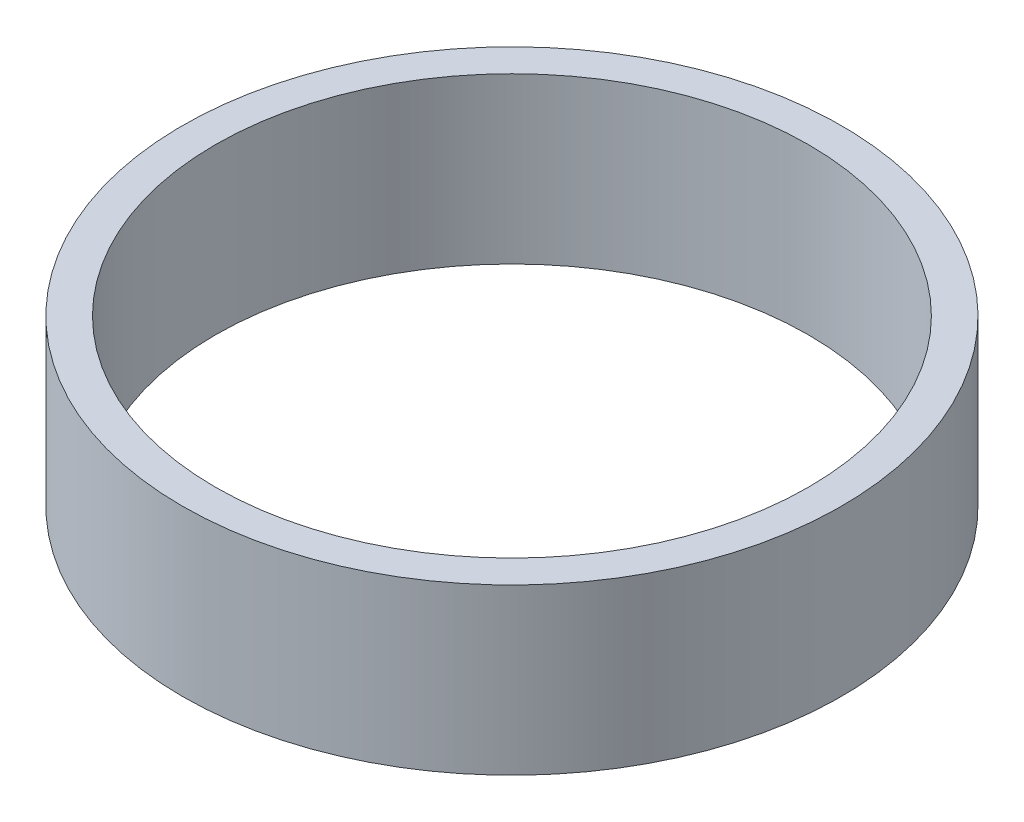
ISO-10303-21;
HEADER;
FILE_DESCRIPTION(('STEP AP214'),'2;1');
FILE_NAME('part.step','',(''),(''),'','','');
FILE_SCHEMA(('AUTOMOTIVE_DESIGN { 1 0 10303 214 1 1 1 1 }'));
ENDSEC;
DATA;
#1=APPLICATION_CONTEXT('core data for automotive mechanical design processes');
#2=APPLICATION_PROTOCOL_DEFINITION('international standard','automotive_design',2000,#1);
#3=PRODUCT_CONTEXT('',#1,'mechanical');
#4=PRODUCT('Part','Part','',(#3));
#5=PRODUCT_RELATED_PRODUCT_CATEGORY('part','',(#4));
#6=PRODUCT_DEFINITION_FORMATION('','',#4);
#7=PRODUCT_DEFINITION_CONTEXT('part definition',#1,'design');
#8=PRODUCT_DEFINITION('design','',#6,#7);
#9=PRODUCT_DEFINITION_SHAPE('','',#8);
#10=(LENGTH_UNIT() NAMED_UNIT(*) SI_UNIT(.MILLI.,.METRE.));
#11=(NAMED_UNIT(*) PLANE_ANGLE_UNIT() SI_UNIT($,.RADIAN.));
#12=(NAMED_UNIT(*) SI_UNIT($,.STERADIAN.) SOLID_ANGLE_UNIT());
#13=UNCERTAINTY_MEASURE_WITH_UNIT(LENGTH_MEASURE(1.E-05),#10,'distance_accuracy_value','');
#14=(GEOMETRIC_REPRESENTATION_CONTEXT(3) GLOBAL_UNCERTAINTY_ASSIGNED_CONTEXT((#13)) GLOBAL_UNIT_ASSIGNED_CONTEXT((#10,
#11,#12)) REPRESENTATION_CONTEXT('',''));
#15=CARTESIAN_POINT('',(0.,0.,0.));
#16=DIRECTION('',(0.,0.,1.));
#17=DIRECTION('',(1.,0.,0.));
#18=AXIS2_PLACEMENT_3D('',#15,#16,#17);
#19=CARTESIAN_POINT('',(0.,20.,0.));
#20=DIRECTION('',(0.,1.,0.));
#21=DIRECTION('',(0.,0.,1.));
#22=AXIS2_PLACEMENT_3D('',#19,#20,#21);
#23=PLANE('',#22);
#24=CARTESIAN_POINT('',(0.,20.,0.));
#25=DIRECTION('',(0.,1.,0.));
#26=DIRECTION('',(0.,0.,1.));
#27=AXIS2_PLACEMENT_3D('',#24,#25,#26);
#28=CIRCLE('',#27,40.);
#29=CARTESIAN_POINT('',(0.,20.,40.));
#30=VERTEX_POINT('',#29);
#31=EDGE_CURVE('E10',#30,#30,#28,.T.);
#32=ORIENTED_EDGE('',*,*,#31,.T.);
#33=EDGE_LOOP('',(#32));
#34=FACE_BOUND('',#33,.T.);
#35=CARTESIAN_POINT('',(0.,20.,0.));
#36=DIRECTION('',(0.,1.,0.));
#37=DIRECTION('',(0.,0.,1.));
#38=AXIS2_PLACEMENT_3D('',#35,#36,#37);
#39=CIRCLE('',#38,36.);
#40=CARTESIAN_POINT('',(0.,20.,36.));
#41=VERTEX_POINT('',#40);
#42=EDGE_CURVE('E46',#41,#41,#39,.T.);
#43=ORIENTED_EDGE('',*,*,#42,.F.);
#44=EDGE_LOOP('',(#43));
#45=FACE_BOUND('',#44,.T.);
#46=ADVANCED_FACE('F35',(#34,#45),#23,.T.);
#47=CARTESIAN_POINT('',(0.,0.,0.));
#48=DIRECTION('',(0.,1.,0.));
#49=DIRECTION('',(0.,0.,1.));
#50=AXIS2_PLACEMENT_3D('',#47,#48,#49);
#51=PLANE('',#50);
#52=CARTESIAN_POINT('',(0.,0.,0.));
#53=DIRECTION('',(0.,1.,0.));
#54=DIRECTION('',(0.,0.,1.));
#55=AXIS2_PLACEMENT_3D('',#52,#53,#54);
#56=CIRCLE('',#55,40.);
#57=CARTESIAN_POINT('',(0.,0.,40.));
#58=VERTEX_POINT('',#57);
#59=EDGE_CURVE('E39',#58,#58,#56,.T.);
#60=ORIENTED_EDGE('',*,*,#59,.F.);
#61=EDGE_LOOP('',(#60));
#62=FACE_BOUND('',#61,.T.);
#63=CARTESIAN_POINT('',(0.,0.,0.));
#64=DIRECTION('',(0.,1.,0.));
#65=DIRECTION('',(0.,0.,1.));
#66=AXIS2_PLACEMENT_3D('',#63,#64,#65);
#67=CIRCLE('',#66,36.);
#68=CARTESIAN_POINT('',(0.,0.,36.));
#69=VERTEX_POINT('',#68);
#70=EDGE_CURVE('E48',#69,#69,#67,.T.);
#71=ORIENTED_EDGE('',*,*,#70,.T.);
#72=EDGE_LOOP('',(#71));
#73=FACE_BOUND('',#72,.T.);
#74=ADVANCED_FACE('F58',(#62,#73),#51,.F.);
#75=CARTESIAN_POINT('',(0.,20.,0.));
#76=DIRECTION('',(0.,-1.,0.));
#77=DIRECTION('',(0.,0.,-1.));
#78=AXIS2_PLACEMENT_3D('',#75,#76,#77);
#79=CYLINDRICAL_SURFACE('',#78,40.);
#80=ORIENTED_EDGE('',*,*,#31,.F.);
#81=EDGE_LOOP('',(#80));
#82=FACE_BOUND('',#81,.T.);
#83=ORIENTED_EDGE('',*,*,#59,.T.);
#84=EDGE_LOOP('',(#83));
#85=FACE_BOUND('',#84,.T.);
#86=ADVANCED_FACE('F37',(#82,#85),#79,.T.);
#87=CARTESIAN_POINT('',(0.,20.,0.));
#88=DIRECTION('',(0.,-1.,0.));
#89=DIRECTION('',(0.,0.,-1.));
#90=AXIS2_PLACEMENT_3D('',#87,#88,#89);
#91=CYLINDRICAL_SURFACE('',#90,36.);
#92=ORIENTED_EDGE('',*,*,#42,.T.);
#93=EDGE_LOOP('',(#92));
#94=FACE_BOUND('',#93,.T.);
#95=ORIENTED_EDGE('',*,*,#70,.F.);
#96=EDGE_LOOP('',(#95));
#97=FACE_BOUND('',#96,.T.);
#98=ADVANCED_FACE('F54',(#94,#97),#91,.F.);
#99=CLOSED_SHELL('',(#46,#74,#86,#98));
#100=MANIFOLD_SOLID_BREP('B2',#99);
#101=ADVANCED_BREP_SHAPE_REPRESENTATION('',(#18,#100),#14);
#102=SHAPE_DEFINITION_REPRESENTATION(#9,#101);
ENDSEC;
END-ISO-10303-21;
